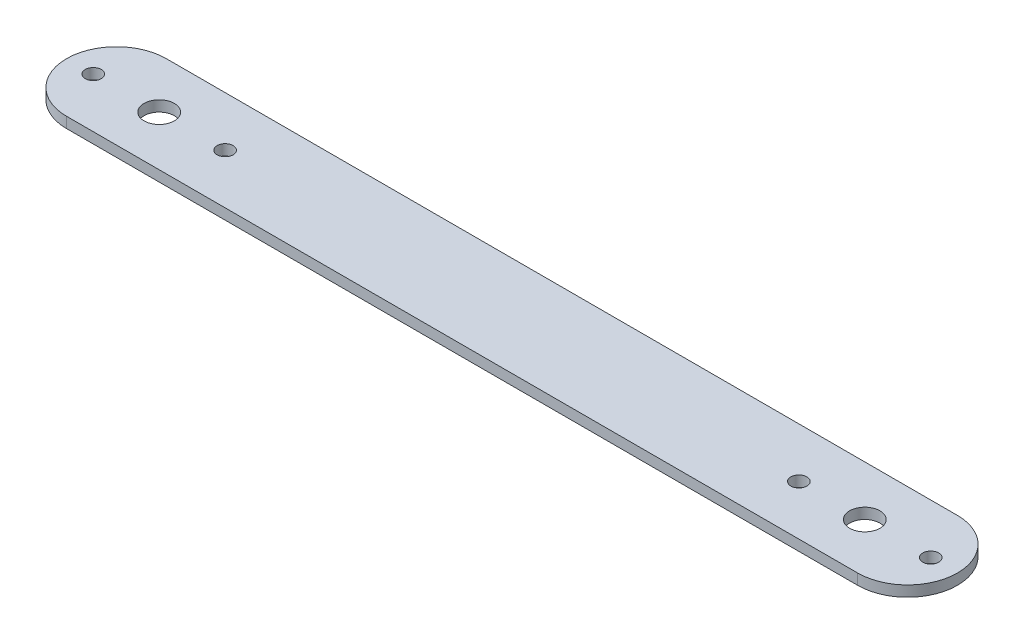
ISO-10303-21;
HEADER;
FILE_DESCRIPTION(('STEP AP214'),'2;1');
FILE_NAME('part.step','',(''),(''),'','','');
FILE_SCHEMA(('AUTOMOTIVE_DESIGN { 1 0 10303 214 1 1 1 1 }'));
ENDSEC;
DATA;
#1=APPLICATION_CONTEXT('core data for automotive mechanical design processes');
#2=APPLICATION_PROTOCOL_DEFINITION('international standard','automotive_design',2000,#1);
#3=PRODUCT_CONTEXT('',#1,'mechanical');
#4=PRODUCT('Part','Part','',(#3));
#5=PRODUCT_RELATED_PRODUCT_CATEGORY('part','',(#4));
#6=PRODUCT_DEFINITION_FORMATION('','',#4);
#7=PRODUCT_DEFINITION_CONTEXT('part definition',#1,'design');
#8=PRODUCT_DEFINITION('design','',#6,#7);
#9=PRODUCT_DEFINITION_SHAPE('','',#8);
#10=(LENGTH_UNIT() NAMED_UNIT(*) SI_UNIT(.MILLI.,.METRE.));
#11=(NAMED_UNIT(*) PLANE_ANGLE_UNIT() SI_UNIT($,.RADIAN.));
#12=(NAMED_UNIT(*) SI_UNIT($,.STERADIAN.) SOLID_ANGLE_UNIT());
#13=UNCERTAINTY_MEASURE_WITH_UNIT(LENGTH_MEASURE(1.E-05),#10,'distance_accuracy_value','');
#14=(GEOMETRIC_REPRESENTATION_CONTEXT(3) GLOBAL_UNCERTAINTY_ASSIGNED_CONTEXT((#13)) GLOBAL_UNIT_ASSIGNED_CONTEXT((#10,
#11,#12)) REPRESENTATION_CONTEXT('',''));
#15=CARTESIAN_POINT('',(0.,0.,0.));
#16=DIRECTION('',(0.,0.,1.));
#17=DIRECTION('',(1.,0.,0.));
#18=AXIS2_PLACEMENT_3D('',#15,#16,#17);
#19=CARTESIAN_POINT('',(111.,0.,0.));
#20=DIRECTION('',(0.,-1.,0.));
#21=DIRECTION('',(0.,0.,-1.));
#22=AXIS2_PLACEMENT_3D('',#19,#20,#21);
#23=CYLINDRICAL_SURFACE('',#22,14.);
#24=DIRECTION('',(0.,1.,0.));
#25=VECTOR('',#24,1.);
#26=CARTESIAN_POINT('',(111.,0.,14.));
#27=LINE('',#26,#25);
#28=CARTESIAN_POINT('',(111.,0.,14.));
#29=VERTEX_POINT('',#28);
#30=CARTESIAN_POINT('',(111.,3.,14.));
#31=VERTEX_POINT('',#30);
#32=EDGE_CURVE('E84',#29,#31,#27,.T.);
#33=ORIENTED_EDGE('',*,*,#32,.F.);
#34=CARTESIAN_POINT('',(111.,0.,0.));
#35=DIRECTION('',(0.,1.,0.));
#36=DIRECTION('',(0.,0.,1.));
#37=AXIS2_PLACEMENT_3D('',#34,#35,#36);
#38=CIRCLE('',#37,14.);
#39=CARTESIAN_POINT('',(111.,0.,-14.));
#40=VERTEX_POINT('',#39);
#41=EDGE_CURVE('E42',#40,#29,#38,.F.);
#42=ORIENTED_EDGE('',*,*,#41,.F.);
#43=DIRECTION('',(0.,-1.,0.));
#44=VECTOR('',#43,1.);
#45=CARTESIAN_POINT('',(111.,3.,-14.));
#46=LINE('',#45,#44);
#47=CARTESIAN_POINT('',(111.,3.,-14.));
#48=VERTEX_POINT('',#47);
#49=EDGE_CURVE('E107',#48,#40,#46,.T.);
#50=ORIENTED_EDGE('',*,*,#49,.F.);
#51=CARTESIAN_POINT('',(111.,3.,0.));
#52=DIRECTION('',(0.,1.,0.));
#53=DIRECTION('',(0.,0.,1.));
#54=AXIS2_PLACEMENT_3D('',#51,#52,#53);
#55=CIRCLE('',#54,14.);
#56=EDGE_CURVE('E11',#31,#48,#55,.T.);
#57=ORIENTED_EDGE('',*,*,#56,.F.);
#58=EDGE_LOOP('',(#33,#42,#50,#57));
#59=FACE_BOUND('',#58,.T.);
#60=ADVANCED_FACE('F35',(#59),#23,.T.);
#61=CARTESIAN_POINT('',(-111.,3.,0.));
#62=DIRECTION('',(0.,-1.,0.));
#63=DIRECTION('',(0.,0.,-1.));
#64=AXIS2_PLACEMENT_3D('',#61,#62,#63);
#65=CYLINDRICAL_SURFACE('',#64,14.);
#66=DIRECTION('',(0.,-1.,0.));
#67=VECTOR('',#66,1.);
#68=CARTESIAN_POINT('',(-111.,3.,14.));
#69=LINE('',#68,#67);
#70=CARTESIAN_POINT('',(-111.,3.,14.));
#71=VERTEX_POINT('',#70);
#72=CARTESIAN_POINT('',(-111.,0.,14.));
#73=VERTEX_POINT('',#72);
#74=EDGE_CURVE('E76',#71,#73,#69,.T.);
#75=ORIENTED_EDGE('',*,*,#74,.F.);
#76=CARTESIAN_POINT('',(-111.,3.,0.));
#77=DIRECTION('',(0.,1.,0.));
#78=DIRECTION('',(0.,0.,1.));
#79=AXIS2_PLACEMENT_3D('',#76,#77,#78);
#80=CIRCLE('',#79,14.);
#81=CARTESIAN_POINT('',(-111.,3.,-14.));
#82=VERTEX_POINT('',#81);
#83=EDGE_CURVE('E85',#82,#71,#80,.T.);
#84=ORIENTED_EDGE('',*,*,#83,.F.);
#85=DIRECTION('',(0.,1.,0.));
#86=VECTOR('',#85,1.);
#87=CARTESIAN_POINT('',(-111.,3.,-14.));
#88=LINE('',#87,#86);
#89=CARTESIAN_POINT('',(-111.,0.,-14.));
#90=VERTEX_POINT('',#89);
#91=EDGE_CURVE('E79',#90,#82,#88,.T.);
#92=ORIENTED_EDGE('',*,*,#91,.F.);
#93=CARTESIAN_POINT('',(-111.,0.,0.));
#94=DIRECTION('',(0.,1.,0.));
#95=DIRECTION('',(0.,0.,1.));
#96=AXIS2_PLACEMENT_3D('',#93,#94,#95);
#97=CIRCLE('',#96,14.);
#98=EDGE_CURVE('E73',#73,#90,#97,.F.);
#99=ORIENTED_EDGE('',*,*,#98,.F.);
#100=EDGE_LOOP('',(#75,#84,#92,#99));
#101=FACE_BOUND('',#100,.T.);
#102=ADVANCED_FACE('F75',(#101),#65,.T.);
#103=CARTESIAN_POINT('',(0.,3.,-14.));
#104=DIRECTION('',(0.,0.,-1.));
#105=DIRECTION('',(-1.,0.,0.));
#106=AXIS2_PLACEMENT_3D('',#103,#104,#105);
#107=PLANE('',#106);
#108=DIRECTION('',(1.,0.,0.));
#109=VECTOR('',#108,1.);
#110=CARTESIAN_POINT('',(0.,3.,-14.));
#111=LINE('',#110,#109);
#112=EDGE_CURVE('E95',#82,#48,#111,.T.);
#113=ORIENTED_EDGE('',*,*,#112,.T.);
#114=ORIENTED_EDGE('',*,*,#49,.T.);
#115=DIRECTION('',(1.,0.,0.));
#116=VECTOR('',#115,1.);
#117=CARTESIAN_POINT('',(0.,0.,-14.));
#118=LINE('',#117,#116);
#119=EDGE_CURVE('E96',#90,#40,#118,.T.);
#120=ORIENTED_EDGE('',*,*,#119,.F.);
#121=ORIENTED_EDGE('',*,*,#91,.T.);
#122=EDGE_LOOP('',(#113,#114,#120,#121));
#123=FACE_BOUND('',#122,.T.);
#124=ADVANCED_FACE('F109',(#123),#107,.T.);
#125=CARTESIAN_POINT('',(0.,3.,14.));
#126=DIRECTION('',(0.,0.,-1.));
#127=DIRECTION('',(-1.,0.,0.));
#128=AXIS2_PLACEMENT_3D('',#125,#126,#127);
#129=PLANE('',#128);
#130=DIRECTION('',(1.,0.,0.));
#131=VECTOR('',#130,1.);
#132=CARTESIAN_POINT('',(0.,0.,14.));
#133=LINE('',#132,#131);
#134=EDGE_CURVE('E91',#73,#29,#133,.T.);
#135=ORIENTED_EDGE('',*,*,#134,.T.);
#136=ORIENTED_EDGE('',*,*,#32,.T.);
#137=DIRECTION('',(1.,0.,0.));
#138=VECTOR('',#137,1.);
#139=CARTESIAN_POINT('',(0.,3.,14.));
#140=LINE('',#139,#138);
#141=EDGE_CURVE('E92',#71,#31,#140,.T.);
#142=ORIENTED_EDGE('',*,*,#141,.F.);
#143=ORIENTED_EDGE('',*,*,#74,.T.);
#144=EDGE_LOOP('',(#135,#136,#142,#143));
#145=FACE_BOUND('',#144,.T.);
#146=ADVANCED_FACE('F89',(#145),#129,.F.);
#147=CARTESIAN_POINT('',(0.,3.,0.));
#148=DIRECTION('',(0.,1.,0.));
#149=DIRECTION('',(0.,0.,1.));
#150=AXIS2_PLACEMENT_3D('',#147,#148,#149);
#151=PLANE('',#150);
#152=CARTESIAN_POINT('',(117.5,3.,0.));
#153=DIRECTION('',(0.,1.,0.));
#154=DIRECTION('',(0.,0.,1.));
#155=AXIS2_PLACEMENT_3D('',#152,#153,#154);
#156=CIRCLE('',#155,2.25);
#157=CARTESIAN_POINT('',(117.5,3.,2.25));
#158=VERTEX_POINT('',#157);
#159=EDGE_CURVE('E144',#158,#158,#156,.T.);
#160=ORIENTED_EDGE('',*,*,#159,.F.);
#161=EDGE_LOOP('',(#160));
#162=FACE_BOUND('',#161,.T.);
#163=CARTESIAN_POINT('',(80.5,3.,0.));
#164=DIRECTION('',(0.,1.,0.));
#165=DIRECTION('',(0.,0.,1.));
#166=AXIS2_PLACEMENT_3D('',#163,#164,#165);
#167=CIRCLE('',#166,2.25);
#168=CARTESIAN_POINT('',(80.5,3.,2.25));
#169=VERTEX_POINT('',#168);
#170=EDGE_CURVE('E138',#169,#169,#167,.T.);
#171=ORIENTED_EDGE('',*,*,#170,.F.);
#172=EDGE_LOOP('',(#171));
#173=FACE_BOUND('',#172,.T.);
#174=CARTESIAN_POINT('',(-80.5,3.,0.));
#175=DIRECTION('',(0.,1.,0.));
#176=DIRECTION('',(0.,0.,1.));
#177=AXIS2_PLACEMENT_3D('',#174,#175,#176);
#178=CIRCLE('',#177,2.25);
#179=CARTESIAN_POINT('',(-80.5,3.,2.25));
#180=VERTEX_POINT('',#179);
#181=EDGE_CURVE('E132',#180,#180,#178,.T.);
#182=ORIENTED_EDGE('',*,*,#181,.F.);
#183=EDGE_LOOP('',(#182));
#184=FACE_BOUND('',#183,.T.);
#185=CARTESIAN_POINT('',(-117.5,3.,0.));
#186=DIRECTION('',(0.,1.,0.));
#187=DIRECTION('',(0.,0.,1.));
#188=AXIS2_PLACEMENT_3D('',#185,#186,#187);
#189=CIRCLE('',#188,2.25);
#190=CARTESIAN_POINT('',(-117.5,3.,2.25));
#191=VERTEX_POINT('',#190);
#192=EDGE_CURVE('E126',#191,#191,#189,.T.);
#193=ORIENTED_EDGE('',*,*,#192,.F.);
#194=EDGE_LOOP('',(#193));
#195=FACE_BOUND('',#194,.T.);
#196=CARTESIAN_POINT('',(99.,3.,0.));
#197=DIRECTION('',(0.,1.,0.));
#198=DIRECTION('',(0.,0.,1.));
#199=AXIS2_PLACEMENT_3D('',#196,#197,#198);
#200=CIRCLE('',#199,4.25000000000001);
#201=CARTESIAN_POINT('',(99.,3.,4.25000000000001));
#202=VERTEX_POINT('',#201);
#203=EDGE_CURVE('E120',#202,#202,#200,.T.);
#204=ORIENTED_EDGE('',*,*,#203,.F.);
#205=EDGE_LOOP('',(#204));
#206=FACE_BOUND('',#205,.T.);
#207=CARTESIAN_POINT('',(-99.,3.,0.));
#208=DIRECTION('',(0.,1.,0.));
#209=DIRECTION('',(0.,0.,1.));
#210=AXIS2_PLACEMENT_3D('',#207,#208,#209);
#211=CIRCLE('',#210,4.25000000000001);
#212=CARTESIAN_POINT('',(-99.,3.,4.25000000000001));
#213=VERTEX_POINT('',#212);
#214=EDGE_CURVE('E114',#213,#213,#211,.T.);
#215=ORIENTED_EDGE('',*,*,#214,.F.);
#216=EDGE_LOOP('',(#215));
#217=FACE_BOUND('',#216,.T.);
#218=ORIENTED_EDGE('',*,*,#141,.T.);
#219=ORIENTED_EDGE('',*,*,#56,.T.);
#220=ORIENTED_EDGE('',*,*,#112,.F.);
#221=ORIENTED_EDGE('',*,*,#83,.T.);
#222=EDGE_LOOP('',(#218,#219,#220,#221));
#223=FACE_BOUND('',#222,.T.);
#224=ADVANCED_FACE('F110',(#162,#173,#184,#195,#206,#217,#223),#151,.T.);
#225=CARTESIAN_POINT('',(0.,0.,0.));
#226=DIRECTION('',(0.,1.,0.));
#227=DIRECTION('',(0.,0.,1.));
#228=AXIS2_PLACEMENT_3D('',#225,#226,#227);
#229=PLANE('',#228);
#230=CARTESIAN_POINT('',(117.5,0.,0.));
#231=DIRECTION('',(0.,1.,0.));
#232=DIRECTION('',(0.,0.,1.));
#233=AXIS2_PLACEMENT_3D('',#230,#231,#232);
#234=CIRCLE('',#233,2.25);
#235=CARTESIAN_POINT('',(117.5,0.,2.25));
#236=VERTEX_POINT('',#235);
#237=EDGE_CURVE('E141',#236,#236,#234,.F.);
#238=ORIENTED_EDGE('',*,*,#237,.F.);
#239=EDGE_LOOP('',(#238));
#240=FACE_BOUND('',#239,.T.);
#241=CARTESIAN_POINT('',(80.5,0.,0.));
#242=DIRECTION('',(0.,1.,0.));
#243=DIRECTION('',(0.,0.,1.));
#244=AXIS2_PLACEMENT_3D('',#241,#242,#243);
#245=CIRCLE('',#244,2.25);
#246=CARTESIAN_POINT('',(80.5,0.,2.25));
#247=VERTEX_POINT('',#246);
#248=EDGE_CURVE('E135',#247,#247,#245,.F.);
#249=ORIENTED_EDGE('',*,*,#248,.F.);
#250=EDGE_LOOP('',(#249));
#251=FACE_BOUND('',#250,.T.);
#252=CARTESIAN_POINT('',(-80.5,0.,0.));
#253=DIRECTION('',(0.,1.,0.));
#254=DIRECTION('',(0.,0.,1.));
#255=AXIS2_PLACEMENT_3D('',#252,#253,#254);
#256=CIRCLE('',#255,2.25);
#257=CARTESIAN_POINT('',(-80.5,0.,2.25));
#258=VERTEX_POINT('',#257);
#259=EDGE_CURVE('E129',#258,#258,#256,.F.);
#260=ORIENTED_EDGE('',*,*,#259,.F.);
#261=EDGE_LOOP('',(#260));
#262=FACE_BOUND('',#261,.T.);
#263=CARTESIAN_POINT('',(-117.5,0.,0.));
#264=DIRECTION('',(0.,1.,0.));
#265=DIRECTION('',(0.,0.,1.));
#266=AXIS2_PLACEMENT_3D('',#263,#264,#265);
#267=CIRCLE('',#266,2.25);
#268=CARTESIAN_POINT('',(-117.5,0.,2.25));
#269=VERTEX_POINT('',#268);
#270=EDGE_CURVE('E123',#269,#269,#267,.F.);
#271=ORIENTED_EDGE('',*,*,#270,.F.);
#272=EDGE_LOOP('',(#271));
#273=FACE_BOUND('',#272,.T.);
#274=CARTESIAN_POINT('',(99.,0.,0.));
#275=DIRECTION('',(0.,1.,0.));
#276=DIRECTION('',(0.,0.,1.));
#277=AXIS2_PLACEMENT_3D('',#274,#275,#276);
#278=CIRCLE('',#277,4.25000000000001);
#279=CARTESIAN_POINT('',(99.,0.,4.25000000000001));
#280=VERTEX_POINT('',#279);
#281=EDGE_CURVE('E117',#280,#280,#278,.F.);
#282=ORIENTED_EDGE('',*,*,#281,.F.);
#283=EDGE_LOOP('',(#282));
#284=FACE_BOUND('',#283,.T.);
#285=CARTESIAN_POINT('',(-99.,0.,0.));
#286=DIRECTION('',(0.,1.,0.));
#287=DIRECTION('',(0.,0.,1.));
#288=AXIS2_PLACEMENT_3D('',#285,#286,#287);
#289=CIRCLE('',#288,4.25000000000001);
#290=CARTESIAN_POINT('',(-99.,0.,4.25000000000001));
#291=VERTEX_POINT('',#290);
#292=EDGE_CURVE('E100',#291,#291,#289,.F.);
#293=ORIENTED_EDGE('',*,*,#292,.F.);
#294=EDGE_LOOP('',(#293));
#295=FACE_BOUND('',#294,.T.);
#296=ORIENTED_EDGE('',*,*,#119,.T.);
#297=ORIENTED_EDGE('',*,*,#41,.T.);
#298=ORIENTED_EDGE('',*,*,#134,.F.);
#299=ORIENTED_EDGE('',*,*,#98,.T.);
#300=EDGE_LOOP('',(#296,#297,#298,#299));
#301=FACE_BOUND('',#300,.T.);
#302=ADVANCED_FACE('F94',(#240,#251,#262,#273,#284,#295,#301),#229,.F.);
#303=CARTESIAN_POINT('',(-99.,-0.00100000000000013,0.));
#304=DIRECTION('',(0.,1.,0.));
#305=DIRECTION('',(0.,0.,1.));
#306=AXIS2_PLACEMENT_3D('',#303,#304,#305);
#307=CYLINDRICAL_SURFACE('',#306,4.25000000000001);
#308=CARTESIAN_POINT('',(-99.,3.,4.25000000000001));
#309=CARTESIAN_POINT('',(-99.,2.96875,4.25000000000001));
#310=CARTESIAN_POINT('',(-99.,2.9375,4.25000000000001));
#311=CARTESIAN_POINT('',(-99.,2.875,4.25000000000001));
#312=CARTESIAN_POINT('',(-99.,2.84375,4.25000000000001));
#313=CARTESIAN_POINT('',(-99.,2.78125,4.25000000000001));
#314=CARTESIAN_POINT('',(-99.,2.75,4.25000000000001));
#315=CARTESIAN_POINT('',(-99.,2.6875,4.25000000000001));
#316=CARTESIAN_POINT('',(-99.,2.65625,4.25000000000001));
#317=CARTESIAN_POINT('',(-99.,2.59375,4.25000000000001));
#318=CARTESIAN_POINT('',(-99.,2.5625,4.25000000000001));
#319=CARTESIAN_POINT('',(-99.,2.5,4.25000000000001));
#320=CARTESIAN_POINT('',(-99.,2.46875,4.25000000000001));
#321=CARTESIAN_POINT('',(-99.,2.40625,4.25000000000001));
#322=CARTESIAN_POINT('',(-99.,2.375,4.25000000000001));
#323=CARTESIAN_POINT('',(-99.,2.3125,4.25000000000001));
#324=CARTESIAN_POINT('',(-99.,2.28125,4.25000000000001));
#325=CARTESIAN_POINT('',(-99.,2.21875,4.25000000000001));
#326=CARTESIAN_POINT('',(-99.,2.1875,4.25000000000001));
#327=CARTESIAN_POINT('',(-99.,2.125,4.25000000000001));
#328=CARTESIAN_POINT('',(-99.,2.09375,4.25000000000001));
#329=CARTESIAN_POINT('',(-99.,2.03125,4.25000000000001));
#330=CARTESIAN_POINT('',(-99.,2.,4.25000000000001));
#331=CARTESIAN_POINT('',(-99.,1.9375,4.25000000000001));
#332=CARTESIAN_POINT('',(-99.,1.90625,4.25000000000001));
#333=CARTESIAN_POINT('',(-99.,1.84375,4.25000000000001));
#334=CARTESIAN_POINT('',(-99.,1.8125,4.25000000000001));
#335=CARTESIAN_POINT('',(-99.,1.75,4.25000000000001));
#336=CARTESIAN_POINT('',(-99.,1.71875,4.25000000000001));
#337=CARTESIAN_POINT('',(-99.,1.65625,4.25000000000001));
#338=CARTESIAN_POINT('',(-99.,1.625,4.25000000000001));
#339=CARTESIAN_POINT('',(-99.,1.5625,4.25000000000001));
#340=CARTESIAN_POINT('',(-99.,1.53125,4.25000000000001));
#341=CARTESIAN_POINT('',(-99.,1.46875,4.25000000000001));
#342=CARTESIAN_POINT('',(-99.,1.4375,4.25000000000001));
#343=CARTESIAN_POINT('',(-99.,1.375,4.25000000000001));
#344=CARTESIAN_POINT('',(-99.,1.34375,4.25000000000001));
#345=CARTESIAN_POINT('',(-99.,1.28125,4.25000000000001));
#346=CARTESIAN_POINT('',(-99.,1.25,4.25000000000001));
#347=CARTESIAN_POINT('',(-99.,1.1875,4.25000000000001));
#348=CARTESIAN_POINT('',(-99.,1.15625,4.25000000000001));
#349=CARTESIAN_POINT('',(-99.,1.09375,4.25000000000001));
#350=CARTESIAN_POINT('',(-99.,1.0625,4.25000000000001));
#351=CARTESIAN_POINT('',(-99.,1.,4.25000000000001));
#352=CARTESIAN_POINT('',(-99.,0.96875,4.25000000000001));
#353=CARTESIAN_POINT('',(-99.,0.90625,4.25000000000001));
#354=CARTESIAN_POINT('',(-99.,0.875,4.25000000000001));
#355=CARTESIAN_POINT('',(-99.,0.8125,4.25000000000001));
#356=CARTESIAN_POINT('',(-99.,0.78125,4.25000000000001));
#357=CARTESIAN_POINT('',(-99.,0.71875,4.25000000000001));
#358=CARTESIAN_POINT('',(-99.,0.6875,4.25000000000001));
#359=CARTESIAN_POINT('',(-99.,0.625,4.25000000000001));
#360=CARTESIAN_POINT('',(-99.,0.59375,4.25000000000001));
#361=CARTESIAN_POINT('',(-99.,0.53125,4.25000000000001));
#362=CARTESIAN_POINT('',(-99.,0.5,4.25000000000001));
#363=CARTESIAN_POINT('',(-99.,0.4375,4.25000000000001));
#364=CARTESIAN_POINT('',(-99.,0.40625,4.25000000000001));
#365=CARTESIAN_POINT('',(-99.,0.34375,4.25000000000001));
#366=CARTESIAN_POINT('',(-99.,0.3125,4.25000000000001));
#367=CARTESIAN_POINT('',(-99.,0.25,4.25000000000001));
#368=CARTESIAN_POINT('',(-99.,0.21875,4.25000000000001));
#369=CARTESIAN_POINT('',(-99.,0.15625,4.25000000000001));
#370=CARTESIAN_POINT('',(-99.,0.125,4.25000000000001));
#371=CARTESIAN_POINT('',(-99.,0.0625000000000001,4.25000000000001));
#372=CARTESIAN_POINT('',(-99.,0.0312500000000001,4.25000000000001));
#373=CARTESIAN_POINT('',(-99.,0.,4.25000000000001));
#374=B_SPLINE_CURVE_WITH_KNOTS('',3,(#308,#309,#310,#311,#312,#313,#314,#315,#316,#317,#318,
#319,#320,#321,#322,#323,#324,#325,#326,#327,#328,#329,#330,#331,#332,#333,#334,#335,#336,#337,
#338,#339,#340,#341,#342,#343,#344,#345,#346,#347,#348,#349,#350,#351,#352,#353,#354,#355,#356,
#357,#358,#359,#360,#361,#362,#363,#364,#365,#366,#367,#368,#369,#370,#371,#372,#373),
.UNSPECIFIED.,.F.,.F.,(4,2,2,2,2,2,2,2,2,2,2,2,2,2,2,2,2,2,2,2,2,2,2,2,2,2,2,2,2,2,2,2,4),(0.,
0.0937500000000001,0.1875,0.28125,0.375,0.46875,0.5625,0.65625,0.75,0.84375,0.9375,1.03125,
1.125,1.21875,1.3125,1.40625,1.5,1.59375,1.6875,1.78125,1.875,1.96875,2.0625,2.15625,2.25,
2.34375,2.4375,2.53125,2.625,2.71875,2.8125,2.90625,3.),.UNSPECIFIED.);
#375=EDGE_CURVE('BSEAM164',#213,#291,#374,.T.);
#376=ORIENTED_EDGE('',*,*,#214,.T.);
#377=ORIENTED_EDGE('',*,*,#292,.T.);
#378=ORIENTED_EDGE('',*,*,#375,.T.);
#379=ORIENTED_EDGE('',*,*,#375,.F.);
#380=EDGE_LOOP('',(#376,#378,#377,#379));
#381=FACE_BOUND('',#380,.T.);
#382=ADVANCED_FACE('F164',(#381),#307,.F.);
#383=CARTESIAN_POINT('',(99.,-0.00100000000000013,0.));
#384=DIRECTION('',(0.,1.,0.));
#385=DIRECTION('',(0.,0.,1.));
#386=AXIS2_PLACEMENT_3D('',#383,#384,#385);
#387=CYLINDRICAL_SURFACE('',#386,4.25000000000001);
#388=CARTESIAN_POINT('',(99.,3.,4.25000000000001));
#389=CARTESIAN_POINT('',(99.,2.96875,4.25000000000001));
#390=CARTESIAN_POINT('',(99.,2.9375,4.25000000000001));
#391=CARTESIAN_POINT('',(99.,2.875,4.25000000000001));
#392=CARTESIAN_POINT('',(99.,2.84375,4.25000000000001));
#393=CARTESIAN_POINT('',(99.,2.78125,4.25000000000001));
#394=CARTESIAN_POINT('',(99.,2.75,4.25000000000001));
#395=CARTESIAN_POINT('',(99.,2.6875,4.25000000000001));
#396=CARTESIAN_POINT('',(99.,2.65625,4.25000000000001));
#397=CARTESIAN_POINT('',(99.,2.59375,4.25000000000001));
#398=CARTESIAN_POINT('',(99.,2.5625,4.25000000000001));
#399=CARTESIAN_POINT('',(99.,2.5,4.25000000000001));
#400=CARTESIAN_POINT('',(99.,2.46875,4.25000000000001));
#401=CARTESIAN_POINT('',(99.,2.40625,4.25000000000001));
#402=CARTESIAN_POINT('',(99.,2.375,4.25000000000001));
#403=CARTESIAN_POINT('',(99.,2.3125,4.25000000000001));
#404=CARTESIAN_POINT('',(99.,2.28125,4.25000000000001));
#405=CARTESIAN_POINT('',(99.,2.21875,4.25000000000001));
#406=CARTESIAN_POINT('',(99.,2.1875,4.25000000000001));
#407=CARTESIAN_POINT('',(99.,2.125,4.25000000000001));
#408=CARTESIAN_POINT('',(99.,2.09375,4.25000000000001));
#409=CARTESIAN_POINT('',(99.,2.03125,4.25000000000001));
#410=CARTESIAN_POINT('',(99.,2.,4.25000000000001));
#411=CARTESIAN_POINT('',(99.,1.9375,4.25000000000001));
#412=CARTESIAN_POINT('',(99.,1.90625,4.25000000000001));
#413=CARTESIAN_POINT('',(99.,1.84375,4.25000000000001));
#414=CARTESIAN_POINT('',(99.,1.8125,4.25000000000001));
#415=CARTESIAN_POINT('',(99.,1.75,4.25000000000001));
#416=CARTESIAN_POINT('',(99.,1.71875,4.25000000000001));
#417=CARTESIAN_POINT('',(99.,1.65625,4.25000000000001));
#418=CARTESIAN_POINT('',(99.,1.625,4.25000000000001));
#419=CARTESIAN_POINT('',(99.,1.5625,4.25000000000001));
#420=CARTESIAN_POINT('',(99.,1.53125,4.25000000000001));
#421=CARTESIAN_POINT('',(99.,1.46875,4.25000000000001));
#422=CARTESIAN_POINT('',(99.,1.4375,4.25000000000001));
#423=CARTESIAN_POINT('',(99.,1.375,4.25000000000001));
#424=CARTESIAN_POINT('',(99.,1.34375,4.25000000000001));
#425=CARTESIAN_POINT('',(99.,1.28125,4.25000000000001));
#426=CARTESIAN_POINT('',(99.,1.25,4.25000000000001));
#427=CARTESIAN_POINT('',(99.,1.1875,4.25000000000001));
#428=CARTESIAN_POINT('',(99.,1.15625,4.25000000000001));
#429=CARTESIAN_POINT('',(99.,1.09375,4.25000000000001));
#430=CARTESIAN_POINT('',(99.,1.0625,4.25000000000001));
#431=CARTESIAN_POINT('',(99.,1.,4.25000000000001));
#432=CARTESIAN_POINT('',(99.,0.96875,4.25000000000001));
#433=CARTESIAN_POINT('',(99.,0.90625,4.25000000000001));
#434=CARTESIAN_POINT('',(99.,0.875,4.25000000000001));
#435=CARTESIAN_POINT('',(99.,0.8125,4.25000000000001));
#436=CARTESIAN_POINT('',(99.,0.78125,4.25000000000001));
#437=CARTESIAN_POINT('',(99.,0.71875,4.25000000000001));
#438=CARTESIAN_POINT('',(99.,0.6875,4.25000000000001));
#439=CARTESIAN_POINT('',(99.,0.625,4.25000000000001));
#440=CARTESIAN_POINT('',(99.,0.59375,4.25000000000001));
#441=CARTESIAN_POINT('',(99.,0.53125,4.25000000000001));
#442=CARTESIAN_POINT('',(99.,0.5,4.25000000000001));
#443=CARTESIAN_POINT('',(99.,0.4375,4.25000000000001));
#444=CARTESIAN_POINT('',(99.,0.40625,4.25000000000001));
#445=CARTESIAN_POINT('',(99.,0.34375,4.25000000000001));
#446=CARTESIAN_POINT('',(99.,0.3125,4.25000000000001));
#447=CARTESIAN_POINT('',(99.,0.25,4.25000000000001));
#448=CARTESIAN_POINT('',(99.,0.21875,4.25000000000001));
#449=CARTESIAN_POINT('',(99.,0.15625,4.25000000000001));
#450=CARTESIAN_POINT('',(99.,0.125,4.25000000000001));
#451=CARTESIAN_POINT('',(99.,0.0625000000000001,4.25000000000001));
#452=CARTESIAN_POINT('',(99.,0.0312500000000001,4.25000000000001));
#453=CARTESIAN_POINT('',(99.,0.,4.25000000000001));
#454=B_SPLINE_CURVE_WITH_KNOTS('',3,(#388,#389,#390,#391,#392,#393,#394,#395,#396,#397,#398,
#399,#400,#401,#402,#403,#404,#405,#406,#407,#408,#409,#410,#411,#412,#413,#414,#415,#416,#417,
#418,#419,#420,#421,#422,#423,#424,#425,#426,#427,#428,#429,#430,#431,#432,#433,#434,#435,#436,
#437,#438,#439,#440,#441,#442,#443,#444,#445,#446,#447,#448,#449,#450,#451,#452,#453),
.UNSPECIFIED.,.F.,.F.,(4,2,2,2,2,2,2,2,2,2,2,2,2,2,2,2,2,2,2,2,2,2,2,2,2,2,2,2,2,2,2,2,4),(0.,
0.0937500000000001,0.1875,0.28125,0.375,0.46875,0.5625,0.65625,0.75,0.84375,0.9375,1.03125,
1.125,1.21875,1.3125,1.40625,1.5,1.59375,1.6875,1.78125,1.875,1.96875,2.0625,2.15625,2.25,
2.34375,2.4375,2.53125,2.625,2.71875,2.8125,2.90625,3.),.UNSPECIFIED.);
#455=EDGE_CURVE('BSEAM167',#202,#280,#454,.T.);
#456=ORIENTED_EDGE('',*,*,#203,.T.);
#457=ORIENTED_EDGE('',*,*,#281,.T.);
#458=ORIENTED_EDGE('',*,*,#455,.T.);
#459=ORIENTED_EDGE('',*,*,#455,.F.);
#460=EDGE_LOOP('',(#456,#458,#457,#459));
#461=FACE_BOUND('',#460,.T.);
#462=ADVANCED_FACE('F167',(#461),#387,.F.);
#463=CARTESIAN_POINT('',(-117.5,-0.00100000000000013,0.));
#464=DIRECTION('',(0.,1.,0.));
#465=DIRECTION('',(0.,0.,1.));
#466=AXIS2_PLACEMENT_3D('',#463,#464,#465);
#467=CYLINDRICAL_SURFACE('',#466,2.25);
#468=CARTESIAN_POINT('',(-117.5,3.,2.25));
#469=CARTESIAN_POINT('',(-117.5,2.96875,2.25));
#470=CARTESIAN_POINT('',(-117.5,2.9375,2.25));
#471=CARTESIAN_POINT('',(-117.5,2.875,2.25));
#472=CARTESIAN_POINT('',(-117.5,2.84375,2.25));
#473=CARTESIAN_POINT('',(-117.5,2.78125,2.25));
#474=CARTESIAN_POINT('',(-117.5,2.75,2.25));
#475=CARTESIAN_POINT('',(-117.5,2.6875,2.25));
#476=CARTESIAN_POINT('',(-117.5,2.65625,2.25));
#477=CARTESIAN_POINT('',(-117.5,2.59375,2.25));
#478=CARTESIAN_POINT('',(-117.5,2.5625,2.25));
#479=CARTESIAN_POINT('',(-117.5,2.5,2.25));
#480=CARTESIAN_POINT('',(-117.5,2.46875,2.25));
#481=CARTESIAN_POINT('',(-117.5,2.40625,2.25));
#482=CARTESIAN_POINT('',(-117.5,2.375,2.25));
#483=CARTESIAN_POINT('',(-117.5,2.3125,2.25));
#484=CARTESIAN_POINT('',(-117.5,2.28125,2.25));
#485=CARTESIAN_POINT('',(-117.5,2.21875,2.25));
#486=CARTESIAN_POINT('',(-117.5,2.1875,2.25));
#487=CARTESIAN_POINT('',(-117.5,2.125,2.25));
#488=CARTESIAN_POINT('',(-117.5,2.09375,2.25));
#489=CARTESIAN_POINT('',(-117.5,2.03125,2.25));
#490=CARTESIAN_POINT('',(-117.5,2.,2.25));
#491=CARTESIAN_POINT('',(-117.5,1.9375,2.25));
#492=CARTESIAN_POINT('',(-117.5,1.90625,2.25));
#493=CARTESIAN_POINT('',(-117.5,1.84375,2.25));
#494=CARTESIAN_POINT('',(-117.5,1.8125,2.25));
#495=CARTESIAN_POINT('',(-117.5,1.75,2.25));
#496=CARTESIAN_POINT('',(-117.5,1.71875,2.25));
#497=CARTESIAN_POINT('',(-117.5,1.65625,2.25));
#498=CARTESIAN_POINT('',(-117.5,1.625,2.25));
#499=CARTESIAN_POINT('',(-117.5,1.5625,2.25));
#500=CARTESIAN_POINT('',(-117.5,1.53125,2.25));
#501=CARTESIAN_POINT('',(-117.5,1.46875,2.25));
#502=CARTESIAN_POINT('',(-117.5,1.4375,2.25));
#503=CARTESIAN_POINT('',(-117.5,1.375,2.25));
#504=CARTESIAN_POINT('',(-117.5,1.34375,2.25));
#505=CARTESIAN_POINT('',(-117.5,1.28125,2.25));
#506=CARTESIAN_POINT('',(-117.5,1.25,2.25));
#507=CARTESIAN_POINT('',(-117.5,1.1875,2.25));
#508=CARTESIAN_POINT('',(-117.5,1.15625,2.25));
#509=CARTESIAN_POINT('',(-117.5,1.09375,2.25));
#510=CARTESIAN_POINT('',(-117.5,1.0625,2.25));
#511=CARTESIAN_POINT('',(-117.5,1.,2.25));
#512=CARTESIAN_POINT('',(-117.5,0.96875,2.25));
#513=CARTESIAN_POINT('',(-117.5,0.90625,2.25));
#514=CARTESIAN_POINT('',(-117.5,0.875,2.25));
#515=CARTESIAN_POINT('',(-117.5,0.8125,2.25));
#516=CARTESIAN_POINT('',(-117.5,0.78125,2.25));
#517=CARTESIAN_POINT('',(-117.5,0.71875,2.25));
#518=CARTESIAN_POINT('',(-117.5,0.6875,2.25));
#519=CARTESIAN_POINT('',(-117.5,0.625,2.25));
#520=CARTESIAN_POINT('',(-117.5,0.59375,2.25));
#521=CARTESIAN_POINT('',(-117.5,0.53125,2.25));
#522=CARTESIAN_POINT('',(-117.5,0.5,2.25));
#523=CARTESIAN_POINT('',(-117.5,0.4375,2.25));
#524=CARTESIAN_POINT('',(-117.5,0.40625,2.25));
#525=CARTESIAN_POINT('',(-117.5,0.34375,2.25));
#526=CARTESIAN_POINT('',(-117.5,0.3125,2.25));
#527=CARTESIAN_POINT('',(-117.5,0.25,2.25));
#528=CARTESIAN_POINT('',(-117.5,0.21875,2.25));
#529=CARTESIAN_POINT('',(-117.5,0.15625,2.25));
#530=CARTESIAN_POINT('',(-117.5,0.125,2.25));
#531=CARTESIAN_POINT('',(-117.5,0.0625000000000001,2.25));
#532=CARTESIAN_POINT('',(-117.5,0.0312500000000001,2.25));
#533=CARTESIAN_POINT('',(-117.5,0.,2.25));
#534=B_SPLINE_CURVE_WITH_KNOTS('',3,(#468,#469,#470,#471,#472,#473,#474,#475,#476,#477,#478,
#479,#480,#481,#482,#483,#484,#485,#486,#487,#488,#489,#490,#491,#492,#493,#494,#495,#496,#497,
#498,#499,#500,#501,#502,#503,#504,#505,#506,#507,#508,#509,#510,#511,#512,#513,#514,#515,#516,
#517,#518,#519,#520,#521,#522,#523,#524,#525,#526,#527,#528,#529,#530,#531,#532,#533),
.UNSPECIFIED.,.F.,.F.,(4,2,2,2,2,2,2,2,2,2,2,2,2,2,2,2,2,2,2,2,2,2,2,2,2,2,2,2,2,2,2,2,4),(0.,
0.0937500000000001,0.1875,0.28125,0.375,0.46875,0.5625,0.65625,0.75,0.84375,0.9375,1.03125,
1.125,1.21875,1.3125,1.40625,1.5,1.59375,1.6875,1.78125,1.875,1.96875,2.0625,2.15625,2.25,
2.34375,2.4375,2.53125,2.625,2.71875,2.8125,2.90625,3.),.UNSPECIFIED.);
#535=EDGE_CURVE('BSEAM216',#191,#269,#534,.T.);
#536=ORIENTED_EDGE('',*,*,#192,.T.);
#537=ORIENTED_EDGE('',*,*,#270,.T.);
#538=ORIENTED_EDGE('',*,*,#535,.T.);
#539=ORIENTED_EDGE('',*,*,#535,.F.);
#540=EDGE_LOOP('',(#536,#538,#537,#539));
#541=FACE_BOUND('',#540,.T.);
#542=ADVANCED_FACE('F216',(#541),#467,.F.);
#543=CARTESIAN_POINT('',(-80.5,-0.00100000000000013,0.));
#544=DIRECTION('',(0.,1.,0.));
#545=DIRECTION('',(0.,0.,1.));
#546=AXIS2_PLACEMENT_3D('',#543,#544,#545);
#547=CYLINDRICAL_SURFACE('',#546,2.25);
#548=CARTESIAN_POINT('',(-80.5,3.,2.25));
#549=CARTESIAN_POINT('',(-80.5,2.96875,2.25));
#550=CARTESIAN_POINT('',(-80.5,2.9375,2.25));
#551=CARTESIAN_POINT('',(-80.5,2.875,2.25));
#552=CARTESIAN_POINT('',(-80.5,2.84375,2.25));
#553=CARTESIAN_POINT('',(-80.5,2.78125,2.25));
#554=CARTESIAN_POINT('',(-80.5,2.75,2.25));
#555=CARTESIAN_POINT('',(-80.5,2.6875,2.25));
#556=CARTESIAN_POINT('',(-80.5,2.65625,2.25));
#557=CARTESIAN_POINT('',(-80.5,2.59375,2.25));
#558=CARTESIAN_POINT('',(-80.5,2.5625,2.25));
#559=CARTESIAN_POINT('',(-80.5,2.5,2.25));
#560=CARTESIAN_POINT('',(-80.5,2.46875,2.25));
#561=CARTESIAN_POINT('',(-80.5,2.40625,2.25));
#562=CARTESIAN_POINT('',(-80.5,2.375,2.25));
#563=CARTESIAN_POINT('',(-80.5,2.3125,2.25));
#564=CARTESIAN_POINT('',(-80.5,2.28125,2.25));
#565=CARTESIAN_POINT('',(-80.5,2.21875,2.25));
#566=CARTESIAN_POINT('',(-80.5,2.1875,2.25));
#567=CARTESIAN_POINT('',(-80.5,2.125,2.25));
#568=CARTESIAN_POINT('',(-80.5,2.09375,2.25));
#569=CARTESIAN_POINT('',(-80.5,2.03125,2.25));
#570=CARTESIAN_POINT('',(-80.5,2.,2.25));
#571=CARTESIAN_POINT('',(-80.5,1.9375,2.25));
#572=CARTESIAN_POINT('',(-80.5,1.90625,2.25));
#573=CARTESIAN_POINT('',(-80.5,1.84375,2.25));
#574=CARTESIAN_POINT('',(-80.5,1.8125,2.25));
#575=CARTESIAN_POINT('',(-80.5,1.75,2.25));
#576=CARTESIAN_POINT('',(-80.5,1.71875,2.25));
#577=CARTESIAN_POINT('',(-80.5,1.65625,2.25));
#578=CARTESIAN_POINT('',(-80.5,1.625,2.25));
#579=CARTESIAN_POINT('',(-80.5,1.5625,2.25));
#580=CARTESIAN_POINT('',(-80.5,1.53125,2.25));
#581=CARTESIAN_POINT('',(-80.5,1.46875,2.25));
#582=CARTESIAN_POINT('',(-80.5,1.4375,2.25));
#583=CARTESIAN_POINT('',(-80.5,1.375,2.25));
#584=CARTESIAN_POINT('',(-80.5,1.34375,2.25));
#585=CARTESIAN_POINT('',(-80.5,1.28125,2.25));
#586=CARTESIAN_POINT('',(-80.5,1.25,2.25));
#587=CARTESIAN_POINT('',(-80.5,1.1875,2.25));
#588=CARTESIAN_POINT('',(-80.5,1.15625,2.25));
#589=CARTESIAN_POINT('',(-80.5,1.09375,2.25));
#590=CARTESIAN_POINT('',(-80.5,1.0625,2.25));
#591=CARTESIAN_POINT('',(-80.5,1.,2.25));
#592=CARTESIAN_POINT('',(-80.5,0.96875,2.25));
#593=CARTESIAN_POINT('',(-80.5,0.90625,2.25));
#594=CARTESIAN_POINT('',(-80.5,0.875,2.25));
#595=CARTESIAN_POINT('',(-80.5,0.8125,2.25));
#596=CARTESIAN_POINT('',(-80.5,0.78125,2.25));
#597=CARTESIAN_POINT('',(-80.5,0.71875,2.25));
#598=CARTESIAN_POINT('',(-80.5,0.6875,2.25));
#599=CARTESIAN_POINT('',(-80.5,0.625,2.25));
#600=CARTESIAN_POINT('',(-80.5,0.59375,2.25));
#601=CARTESIAN_POINT('',(-80.5,0.53125,2.25));
#602=CARTESIAN_POINT('',(-80.5,0.5,2.25));
#603=CARTESIAN_POINT('',(-80.5,0.4375,2.25));
#604=CARTESIAN_POINT('',(-80.5,0.40625,2.25));
#605=CARTESIAN_POINT('',(-80.5,0.34375,2.25));
#606=CARTESIAN_POINT('',(-80.5,0.3125,2.25));
#607=CARTESIAN_POINT('',(-80.5,0.25,2.25));
#608=CARTESIAN_POINT('',(-80.5,0.21875,2.25));
#609=CARTESIAN_POINT('',(-80.5,0.15625,2.25));
#610=CARTESIAN_POINT('',(-80.5,0.125,2.25));
#611=CARTESIAN_POINT('',(-80.5,0.0625000000000001,2.25));
#612=CARTESIAN_POINT('',(-80.5,0.0312500000000001,2.25));
#613=CARTESIAN_POINT('',(-80.5,0.,2.25));
#614=B_SPLINE_CURVE_WITH_KNOTS('',3,(#548,#549,#550,#551,#552,#553,#554,#555,#556,#557,#558,
#559,#560,#561,#562,#563,#564,#565,#566,#567,#568,#569,#570,#571,#572,#573,#574,#575,#576,#577,
#578,#579,#580,#581,#582,#583,#584,#585,#586,#587,#588,#589,#590,#591,#592,#593,#594,#595,#596,
#597,#598,#599,#600,#601,#602,#603,#604,#605,#606,#607,#608,#609,#610,#611,#612,#613),
.UNSPECIFIED.,.F.,.F.,(4,2,2,2,2,2,2,2,2,2,2,2,2,2,2,2,2,2,2,2,2,2,2,2,2,2,2,2,2,2,2,2,4),(0.,
0.0937500000000001,0.1875,0.28125,0.375,0.46875,0.5625,0.65625,0.75,0.84375,0.9375,1.03125,
1.125,1.21875,1.3125,1.40625,1.5,1.59375,1.6875,1.78125,1.875,1.96875,2.0625,2.15625,2.25,
2.34375,2.4375,2.53125,2.625,2.71875,2.8125,2.90625,3.),.UNSPECIFIED.);
#615=EDGE_CURVE('BSEAM224',#180,#258,#614,.T.);
#616=ORIENTED_EDGE('',*,*,#181,.T.);
#617=ORIENTED_EDGE('',*,*,#259,.T.);
#618=ORIENTED_EDGE('',*,*,#615,.T.);
#619=ORIENTED_EDGE('',*,*,#615,.F.);
#620=EDGE_LOOP('',(#616,#618,#617,#619));
#621=FACE_BOUND('',#620,.T.);
#622=ADVANCED_FACE('F224',(#621),#547,.F.);
#623=CARTESIAN_POINT('',(80.5,-0.00100000000000013,0.));
#624=DIRECTION('',(0.,1.,0.));
#625=DIRECTION('',(0.,0.,1.));
#626=AXIS2_PLACEMENT_3D('',#623,#624,#625);
#627=CYLINDRICAL_SURFACE('',#626,2.25);
#628=CARTESIAN_POINT('',(80.5,3.,2.25));
#629=CARTESIAN_POINT('',(80.5,2.96875,2.25));
#630=CARTESIAN_POINT('',(80.5,2.9375,2.25));
#631=CARTESIAN_POINT('',(80.5,2.875,2.25));
#632=CARTESIAN_POINT('',(80.5,2.84375,2.25));
#633=CARTESIAN_POINT('',(80.5,2.78125,2.25));
#634=CARTESIAN_POINT('',(80.5,2.75,2.25));
#635=CARTESIAN_POINT('',(80.5,2.6875,2.25));
#636=CARTESIAN_POINT('',(80.5,2.65625,2.25));
#637=CARTESIAN_POINT('',(80.5,2.59375,2.25));
#638=CARTESIAN_POINT('',(80.5,2.5625,2.25));
#639=CARTESIAN_POINT('',(80.5,2.5,2.25));
#640=CARTESIAN_POINT('',(80.5,2.46875,2.25));
#641=CARTESIAN_POINT('',(80.5,2.40625,2.25));
#642=CARTESIAN_POINT('',(80.5,2.375,2.25));
#643=CARTESIAN_POINT('',(80.5,2.3125,2.25));
#644=CARTESIAN_POINT('',(80.5,2.28125,2.25));
#645=CARTESIAN_POINT('',(80.5,2.21875,2.25));
#646=CARTESIAN_POINT('',(80.5,2.1875,2.25));
#647=CARTESIAN_POINT('',(80.5,2.125,2.25));
#648=CARTESIAN_POINT('',(80.5,2.09375,2.25));
#649=CARTESIAN_POINT('',(80.5,2.03125,2.25));
#650=CARTESIAN_POINT('',(80.5,2.,2.25));
#651=CARTESIAN_POINT('',(80.5,1.9375,2.25));
#652=CARTESIAN_POINT('',(80.5,1.90625,2.25));
#653=CARTESIAN_POINT('',(80.5,1.84375,2.25));
#654=CARTESIAN_POINT('',(80.5,1.8125,2.25));
#655=CARTESIAN_POINT('',(80.5,1.75,2.25));
#656=CARTESIAN_POINT('',(80.5,1.71875,2.25));
#657=CARTESIAN_POINT('',(80.5,1.65625,2.25));
#658=CARTESIAN_POINT('',(80.5,1.625,2.25));
#659=CARTESIAN_POINT('',(80.5,1.5625,2.25));
#660=CARTESIAN_POINT('',(80.5,1.53125,2.25));
#661=CARTESIAN_POINT('',(80.5,1.46875,2.25));
#662=CARTESIAN_POINT('',(80.5,1.4375,2.25));
#663=CARTESIAN_POINT('',(80.5,1.375,2.25));
#664=CARTESIAN_POINT('',(80.5,1.34375,2.25));
#665=CARTESIAN_POINT('',(80.5,1.28125,2.25));
#666=CARTESIAN_POINT('',(80.5,1.25,2.25));
#667=CARTESIAN_POINT('',(80.5,1.1875,2.25));
#668=CARTESIAN_POINT('',(80.5,1.15625,2.25));
#669=CARTESIAN_POINT('',(80.5,1.09375,2.25));
#670=CARTESIAN_POINT('',(80.5,1.0625,2.25));
#671=CARTESIAN_POINT('',(80.5,1.,2.25));
#672=CARTESIAN_POINT('',(80.5,0.96875,2.25));
#673=CARTESIAN_POINT('',(80.5,0.90625,2.25));
#674=CARTESIAN_POINT('',(80.5,0.875,2.25));
#675=CARTESIAN_POINT('',(80.5,0.8125,2.25));
#676=CARTESIAN_POINT('',(80.5,0.78125,2.25));
#677=CARTESIAN_POINT('',(80.5,0.71875,2.25));
#678=CARTESIAN_POINT('',(80.5,0.6875,2.25));
#679=CARTESIAN_POINT('',(80.5,0.625,2.25));
#680=CARTESIAN_POINT('',(80.5,0.59375,2.25));
#681=CARTESIAN_POINT('',(80.5,0.53125,2.25));
#682=CARTESIAN_POINT('',(80.5,0.5,2.25));
#683=CARTESIAN_POINT('',(80.5,0.4375,2.25));
#684=CARTESIAN_POINT('',(80.5,0.40625,2.25));
#685=CARTESIAN_POINT('',(80.5,0.34375,2.25));
#686=CARTESIAN_POINT('',(80.5,0.3125,2.25));
#687=CARTESIAN_POINT('',(80.5,0.25,2.25));
#688=CARTESIAN_POINT('',(80.5,0.21875,2.25));
#689=CARTESIAN_POINT('',(80.5,0.15625,2.25));
#690=CARTESIAN_POINT('',(80.5,0.125,2.25));
#691=CARTESIAN_POINT('',(80.5,0.0625000000000001,2.25));
#692=CARTESIAN_POINT('',(80.5,0.0312500000000001,2.25));
#693=CARTESIAN_POINT('',(80.5,0.,2.25));
#694=B_SPLINE_CURVE_WITH_KNOTS('',3,(#628,#629,#630,#631,#632,#633,#634,#635,#636,#637,#638,
#639,#640,#641,#642,#643,#644,#645,#646,#647,#648,#649,#650,#651,#652,#653,#654,#655,#656,#657,
#658,#659,#660,#661,#662,#663,#664,#665,#666,#667,#668,#669,#670,#671,#672,#673,#674,#675,#676,
#677,#678,#679,#680,#681,#682,#683,#684,#685,#686,#687,#688,#689,#690,#691,#692,#693),
.UNSPECIFIED.,.F.,.F.,(4,2,2,2,2,2,2,2,2,2,2,2,2,2,2,2,2,2,2,2,2,2,2,2,2,2,2,2,2,2,2,2,4),(0.,
0.0937500000000001,0.1875,0.28125,0.375,0.46875,0.5625,0.65625,0.75,0.84375,0.9375,1.03125,
1.125,1.21875,1.3125,1.40625,1.5,1.59375,1.6875,1.78125,1.875,1.96875,2.0625,2.15625,2.25,
2.34375,2.4375,2.53125,2.625,2.71875,2.8125,2.90625,3.),.UNSPECIFIED.);
#695=EDGE_CURVE('BSEAM232',#169,#247,#694,.T.);
#696=ORIENTED_EDGE('',*,*,#170,.T.);
#697=ORIENTED_EDGE('',*,*,#248,.T.);
#698=ORIENTED_EDGE('',*,*,#695,.T.);
#699=ORIENTED_EDGE('',*,*,#695,.F.);
#700=EDGE_LOOP('',(#696,#698,#697,#699));
#701=FACE_BOUND('',#700,.T.);
#702=ADVANCED_FACE('F232',(#701),#627,.F.);
#703=CARTESIAN_POINT('',(117.5,-0.00100000000000013,0.));
#704=DIRECTION('',(0.,1.,0.));
#705=DIRECTION('',(0.,0.,1.));
#706=AXIS2_PLACEMENT_3D('',#703,#704,#705);
#707=CYLINDRICAL_SURFACE('',#706,2.25);
#708=CARTESIAN_POINT('',(117.5,3.,2.25));
#709=CARTESIAN_POINT('',(117.5,2.96875,2.25));
#710=CARTESIAN_POINT('',(117.5,2.9375,2.25));
#711=CARTESIAN_POINT('',(117.5,2.875,2.25));
#712=CARTESIAN_POINT('',(117.5,2.84375,2.25));
#713=CARTESIAN_POINT('',(117.5,2.78125,2.25));
#714=CARTESIAN_POINT('',(117.5,2.75,2.25));
#715=CARTESIAN_POINT('',(117.5,2.6875,2.25));
#716=CARTESIAN_POINT('',(117.5,2.65625,2.25));
#717=CARTESIAN_POINT('',(117.5,2.59375,2.25));
#718=CARTESIAN_POINT('',(117.5,2.5625,2.25));
#719=CARTESIAN_POINT('',(117.5,2.5,2.25));
#720=CARTESIAN_POINT('',(117.5,2.46875,2.25));
#721=CARTESIAN_POINT('',(117.5,2.40625,2.25));
#722=CARTESIAN_POINT('',(117.5,2.375,2.25));
#723=CARTESIAN_POINT('',(117.5,2.3125,2.25));
#724=CARTESIAN_POINT('',(117.5,2.28125,2.25));
#725=CARTESIAN_POINT('',(117.5,2.21875,2.25));
#726=CARTESIAN_POINT('',(117.5,2.1875,2.25));
#727=CARTESIAN_POINT('',(117.5,2.125,2.25));
#728=CARTESIAN_POINT('',(117.5,2.09375,2.25));
#729=CARTESIAN_POINT('',(117.5,2.03125,2.25));
#730=CARTESIAN_POINT('',(117.5,2.,2.25));
#731=CARTESIAN_POINT('',(117.5,1.9375,2.25));
#732=CARTESIAN_POINT('',(117.5,1.90625,2.25));
#733=CARTESIAN_POINT('',(117.5,1.84375,2.25));
#734=CARTESIAN_POINT('',(117.5,1.8125,2.25));
#735=CARTESIAN_POINT('',(117.5,1.75,2.25));
#736=CARTESIAN_POINT('',(117.5,1.71875,2.25));
#737=CARTESIAN_POINT('',(117.5,1.65625,2.25));
#738=CARTESIAN_POINT('',(117.5,1.625,2.25));
#739=CARTESIAN_POINT('',(117.5,1.5625,2.25));
#740=CARTESIAN_POINT('',(117.5,1.53125,2.25));
#741=CARTESIAN_POINT('',(117.5,1.46875,2.25));
#742=CARTESIAN_POINT('',(117.5,1.4375,2.25));
#743=CARTESIAN_POINT('',(117.5,1.375,2.25));
#744=CARTESIAN_POINT('',(117.5,1.34375,2.25));
#745=CARTESIAN_POINT('',(117.5,1.28125,2.25));
#746=CARTESIAN_POINT('',(117.5,1.25,2.25));
#747=CARTESIAN_POINT('',(117.5,1.1875,2.25));
#748=CARTESIAN_POINT('',(117.5,1.15625,2.25));
#749=CARTESIAN_POINT('',(117.5,1.09375,2.25));
#750=CARTESIAN_POINT('',(117.5,1.0625,2.25));
#751=CARTESIAN_POINT('',(117.5,1.,2.25));
#752=CARTESIAN_POINT('',(117.5,0.96875,2.25));
#753=CARTESIAN_POINT('',(117.5,0.90625,2.25));
#754=CARTESIAN_POINT('',(117.5,0.875,2.25));
#755=CARTESIAN_POINT('',(117.5,0.8125,2.25));
#756=CARTESIAN_POINT('',(117.5,0.78125,2.25));
#757=CARTESIAN_POINT('',(117.5,0.71875,2.25));
#758=CARTESIAN_POINT('',(117.5,0.6875,2.25));
#759=CARTESIAN_POINT('',(117.5,0.625,2.25));
#760=CARTESIAN_POINT('',(117.5,0.59375,2.25));
#761=CARTESIAN_POINT('',(117.5,0.53125,2.25));
#762=CARTESIAN_POINT('',(117.5,0.5,2.25));
#763=CARTESIAN_POINT('',(117.5,0.4375,2.25));
#764=CARTESIAN_POINT('',(117.5,0.40625,2.25));
#765=CARTESIAN_POINT('',(117.5,0.34375,2.25));
#766=CARTESIAN_POINT('',(117.5,0.3125,2.25));
#767=CARTESIAN_POINT('',(117.5,0.25,2.25));
#768=CARTESIAN_POINT('',(117.5,0.21875,2.25));
#769=CARTESIAN_POINT('',(117.5,0.15625,2.25));
#770=CARTESIAN_POINT('',(117.5,0.125,2.25));
#771=CARTESIAN_POINT('',(117.5,0.0625000000000001,2.25));
#772=CARTESIAN_POINT('',(117.5,0.0312500000000001,2.25));
#773=CARTESIAN_POINT('',(117.5,0.,2.25));
#774=B_SPLINE_CURVE_WITH_KNOTS('',3,(#708,#709,#710,#711,#712,#713,#714,#715,#716,#717,#718,
#719,#720,#721,#722,#723,#724,#725,#726,#727,#728,#729,#730,#731,#732,#733,#734,#735,#736,#737,
#738,#739,#740,#741,#742,#743,#744,#745,#746,#747,#748,#749,#750,#751,#752,#753,#754,#755,#756,
#757,#758,#759,#760,#761,#762,#763,#764,#765,#766,#767,#768,#769,#770,#771,#772,#773),
.UNSPECIFIED.,.F.,.F.,(4,2,2,2,2,2,2,2,2,2,2,2,2,2,2,2,2,2,2,2,2,2,2,2,2,2,2,2,2,2,2,2,4),(0.,
0.0937500000000001,0.1875,0.28125,0.375,0.46875,0.5625,0.65625,0.75,0.84375,0.9375,1.03125,
1.125,1.21875,1.3125,1.40625,1.5,1.59375,1.6875,1.78125,1.875,1.96875,2.0625,2.15625,2.25,
2.34375,2.4375,2.53125,2.625,2.71875,2.8125,2.90625,3.),.UNSPECIFIED.);
#775=EDGE_CURVE('BSEAM148',#158,#236,#774,.T.);
#776=ORIENTED_EDGE('',*,*,#159,.T.);
#777=ORIENTED_EDGE('',*,*,#237,.T.);
#778=ORIENTED_EDGE('',*,*,#775,.T.);
#779=ORIENTED_EDGE('',*,*,#775,.F.);
#780=EDGE_LOOP('',(#776,#778,#777,#779));
#781=FACE_BOUND('',#780,.T.);
#782=ADVANCED_FACE('F148',(#781),#707,.F.);
#783=CLOSED_SHELL('',(#60,#102,#124,#146,#224,#302,#382,#462,#542,#622,#702,#782));
#784=MANIFOLD_SOLID_BREP('B2',#783);
#785=ADVANCED_BREP_SHAPE_REPRESENTATION('',(#18,#784),#14);
#786=SHAPE_DEFINITION_REPRESENTATION(#9,#785);
ENDSEC;
END-ISO-10303-21;
